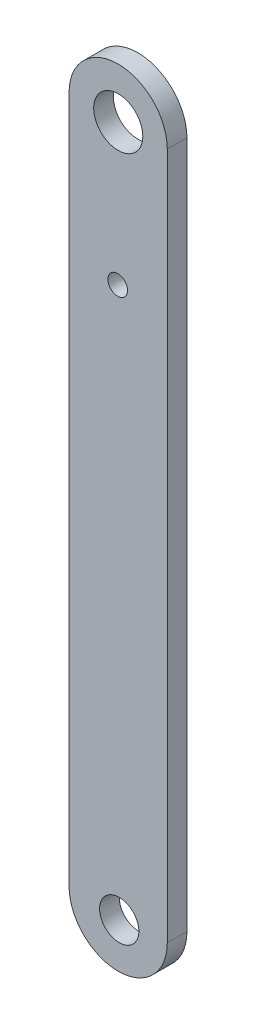
ISO-10303-21;
HEADER;
FILE_DESCRIPTION(('STEP AP214'),'2;1');
FILE_NAME('part.step','',(''),(''),'','','');
FILE_SCHEMA(('AUTOMOTIVE_DESIGN { 1 0 10303 214 1 1 1 1 }'));
ENDSEC;
DATA;
#1=APPLICATION_CONTEXT('core data for automotive mechanical design processes');
#2=APPLICATION_PROTOCOL_DEFINITION('international standard','automotive_design',2000,#1);
#3=PRODUCT_CONTEXT('',#1,'mechanical');
#4=PRODUCT('Part','Part','',(#3));
#5=PRODUCT_RELATED_PRODUCT_CATEGORY('part','',(#4));
#6=PRODUCT_DEFINITION_FORMATION('','',#4);
#7=PRODUCT_DEFINITION_CONTEXT('part definition',#1,'design');
#8=PRODUCT_DEFINITION('design','',#6,#7);
#9=PRODUCT_DEFINITION_SHAPE('','',#8);
#10=(LENGTH_UNIT() NAMED_UNIT(*) SI_UNIT(.MILLI.,.METRE.));
#11=(NAMED_UNIT(*) PLANE_ANGLE_UNIT() SI_UNIT($,.RADIAN.));
#12=(NAMED_UNIT(*) SI_UNIT($,.STERADIAN.) SOLID_ANGLE_UNIT());
#13=UNCERTAINTY_MEASURE_WITH_UNIT(LENGTH_MEASURE(1.E-05),#10,'distance_accuracy_value','');
#14=(GEOMETRIC_REPRESENTATION_CONTEXT(3) GLOBAL_UNCERTAINTY_ASSIGNED_CONTEXT((#13)) GLOBAL_UNIT_ASSIGNED_CONTEXT((#10,
#11,#12)) REPRESENTATION_CONTEXT('',''));
#15=CARTESIAN_POINT('',(0.,0.,0.));
#16=DIRECTION('',(0.,0.,1.));
#17=DIRECTION('',(1.,0.,0.));
#18=AXIS2_PLACEMENT_3D('',#15,#16,#17);
#19=CARTESIAN_POINT('',(-18.3407411522863,36.8292682926829,2.));
#20=DIRECTION('',(0.,0.,-1.));
#21=DIRECTION('',(-1.,0.,0.));
#22=AXIS2_PLACEMENT_3D('',#19,#20,#21);
#23=CYLINDRICAL_SURFACE('',#22,5.);
#24=CARTESIAN_POINT('',(-18.3407411522863,36.8292682926829,0.));
#25=DIRECTION('',(0.,0.,1.));
#26=DIRECTION('',(-1.,0.,0.));
#27=AXIS2_PLACEMENT_3D('',#24,#25,#26);
#28=CIRCLE('',#27,5.);
#29=CARTESIAN_POINT('',(-13.3407411522863,36.8292682926829,0.));
#30=VERTEX_POINT('',#29);
#31=CARTESIAN_POINT('',(-23.3407411522863,36.8292682926829,0.));
#32=VERTEX_POINT('',#31);
#33=EDGE_CURVE('E117',#30,#32,#28,.T.);
#34=ORIENTED_EDGE('',*,*,#33,.T.);
#35=DIRECTION('',(0.,0.,-1.));
#36=VECTOR('',#35,1.);
#37=CARTESIAN_POINT('',(-23.3407411522863,36.8292682926829,2.));
#38=LINE('',#37,#36);
#39=CARTESIAN_POINT('',(-23.3407411522863,36.8292682926829,2.));
#40=VERTEX_POINT('',#39);
#41=EDGE_CURVE('E11',#40,#32,#38,.T.);
#42=ORIENTED_EDGE('',*,*,#41,.F.);
#43=CARTESIAN_POINT('',(-18.3407411522863,36.8292682926829,2.));
#44=DIRECTION('',(0.,0.,1.));
#45=DIRECTION('',(-1.,0.,0.));
#46=AXIS2_PLACEMENT_3D('',#43,#44,#45);
#47=CIRCLE('',#46,5.);
#48=CARTESIAN_POINT('',(-13.3407411522863,36.8292682926829,2.));
#49=VERTEX_POINT('',#48);
#50=EDGE_CURVE('E101',#49,#40,#47,.T.);
#51=ORIENTED_EDGE('',*,*,#50,.F.);
#52=DIRECTION('',(0.,0.,-1.));
#53=VECTOR('',#52,1.);
#54=CARTESIAN_POINT('',(-13.3407411522863,36.8292682926829,2.));
#55=LINE('',#54,#53);
#56=EDGE_CURVE('E113',#49,#30,#55,.T.);
#57=ORIENTED_EDGE('',*,*,#56,.T.);
#58=EDGE_LOOP('',(#34,#42,#51,#57));
#59=FACE_BOUND('',#58,.T.);
#60=ADVANCED_FACE('F49',(#59),#23,.T.);
#61=CARTESIAN_POINT('',(-23.3407411522863,36.8292682926829,2.));
#62=DIRECTION('',(1.,0.,0.));
#63=DIRECTION('',(0.,1.,0.));
#64=AXIS2_PLACEMENT_3D('',#61,#62,#63);
#65=PLANE('',#64);
#66=DIRECTION('',(0.,-1.,0.));
#67=VECTOR('',#66,1.);
#68=CARTESIAN_POINT('',(-23.3407411522863,36.8292682926829,0.));
#69=LINE('',#68,#67);
#70=CARTESIAN_POINT('',(-23.3407411522862,-33.1707317073171,0.));
#71=VERTEX_POINT('',#70);
#72=EDGE_CURVE('E106',#32,#71,#69,.T.);
#73=ORIENTED_EDGE('',*,*,#72,.T.);
#74=DIRECTION('',(0.,0.,-1.));
#75=VECTOR('',#74,1.);
#76=CARTESIAN_POINT('',(-23.3407411522862,-33.1707317073171,2.));
#77=LINE('',#76,#75);
#78=CARTESIAN_POINT('',(-23.3407411522862,-33.1707317073171,2.));
#79=VERTEX_POINT('',#78);
#80=EDGE_CURVE('E58',#79,#71,#77,.T.);
#81=ORIENTED_EDGE('',*,*,#80,.F.);
#82=DIRECTION('',(0.,-1.,0.));
#83=VECTOR('',#82,1.);
#84=CARTESIAN_POINT('',(-23.3407411522863,36.8292682926829,2.));
#85=LINE('',#84,#83);
#86=EDGE_CURVE('E96',#40,#79,#85,.T.);
#87=ORIENTED_EDGE('',*,*,#86,.F.);
#88=ORIENTED_EDGE('',*,*,#41,.T.);
#89=EDGE_LOOP('',(#73,#81,#87,#88));
#90=FACE_BOUND('',#89,.T.);
#91=ADVANCED_FACE('F105',(#90),#65,.F.);
#92=CARTESIAN_POINT('',(-18.3407411522862,-33.1707317073171,2.));
#93=DIRECTION('',(0.,0.,-1.));
#94=DIRECTION('',(-1.,0.,0.));
#95=AXIS2_PLACEMENT_3D('',#92,#93,#94);
#96=CYLINDRICAL_SURFACE('',#95,5.);
#97=CARTESIAN_POINT('',(-18.3407411522862,-33.1707317073171,0.));
#98=DIRECTION('',(0.,0.,1.));
#99=DIRECTION('',(1.,0.,0.));
#100=AXIS2_PLACEMENT_3D('',#97,#98,#99);
#101=CIRCLE('',#100,5.);
#102=CARTESIAN_POINT('',(-13.3407411522862,-33.1707317073171,0.));
#103=VERTEX_POINT('',#102);
#104=EDGE_CURVE('E83',#71,#103,#101,.T.);
#105=ORIENTED_EDGE('',*,*,#104,.T.);
#106=DIRECTION('',(0.,0.,-1.));
#107=VECTOR('',#106,1.);
#108=CARTESIAN_POINT('',(-13.3407411522862,-33.1707317073171,2.));
#109=LINE('',#108,#107);
#110=CARTESIAN_POINT('',(-13.3407411522862,-33.1707317073171,2.));
#111=VERTEX_POINT('',#110);
#112=EDGE_CURVE('E108',#111,#103,#109,.T.);
#113=ORIENTED_EDGE('',*,*,#112,.F.);
#114=CARTESIAN_POINT('',(-18.3407411522862,-33.1707317073171,2.));
#115=DIRECTION('',(0.,0.,1.));
#116=DIRECTION('',(1.,0.,0.));
#117=AXIS2_PLACEMENT_3D('',#114,#115,#116);
#118=CIRCLE('',#117,5.);
#119=EDGE_CURVE('E99',#79,#111,#118,.T.);
#120=ORIENTED_EDGE('',*,*,#119,.F.);
#121=ORIENTED_EDGE('',*,*,#80,.T.);
#122=EDGE_LOOP('',(#105,#113,#120,#121));
#123=FACE_BOUND('',#122,.T.);
#124=ADVANCED_FACE('F109',(#123),#96,.T.);
#125=CARTESIAN_POINT('',(-13.3407411522862,-33.1707317073171,2.));
#126=DIRECTION('',(-1.,0.,0.));
#127=DIRECTION('',(0.,-1.,0.));
#128=AXIS2_PLACEMENT_3D('',#125,#126,#127);
#129=PLANE('',#128);
#130=DIRECTION('',(0.,1.,0.));
#131=VECTOR('',#130,1.);
#132=CARTESIAN_POINT('',(-13.3407411522862,-33.1707317073171,0.));
#133=LINE('',#132,#131);
#134=EDGE_CURVE('E89',#103,#30,#133,.T.);
#135=ORIENTED_EDGE('',*,*,#134,.T.);
#136=ORIENTED_EDGE('',*,*,#56,.F.);
#137=DIRECTION('',(0.,1.,0.));
#138=VECTOR('',#137,1.);
#139=CARTESIAN_POINT('',(-13.3407411522862,-33.1707317073171,2.));
#140=LINE('',#139,#138);
#141=EDGE_CURVE('E66',#111,#49,#140,.T.);
#142=ORIENTED_EDGE('',*,*,#141,.F.);
#143=ORIENTED_EDGE('',*,*,#112,.T.);
#144=EDGE_LOOP('',(#135,#136,#142,#143));
#145=FACE_BOUND('',#144,.T.);
#146=ADVANCED_FACE('F131',(#145),#129,.F.);
#147=CARTESIAN_POINT('',(-18.3407411522863,36.8292682926829,2.));
#148=DIRECTION('',(0.,0.,-1.));
#149=DIRECTION('',(-1.,0.,0.));
#150=AXIS2_PLACEMENT_3D('',#147,#148,#149);
#151=PLANE('',#150);
#152=CARTESIAN_POINT('',(-18.3359512369453,36.7097426622821,2.));
#153=DIRECTION('',(0.,0.,1.));
#154=DIRECTION('',(1.,0.,0.));
#155=AXIS2_PLACEMENT_3D('',#152,#153,#154);
#156=CIRCLE('',#155,2.5);
#157=CARTESIAN_POINT('',(-15.8359512369453,36.7097426622821,2.));
#158=VERTEX_POINT('',#157);
#159=EDGE_CURVE('E154',#158,#158,#156,.T.);
#160=ORIENTED_EDGE('',*,*,#159,.F.);
#161=EDGE_LOOP('',(#160));
#162=FACE_BOUND('',#161,.T.);
#163=CARTESIAN_POINT('',(-18.3870563319339,22.3304896398927,2.));
#164=DIRECTION('',(0.,0.,1.));
#165=DIRECTION('',(1.,0.,0.));
#166=AXIS2_PLACEMENT_3D('',#163,#164,#165);
#167=CIRCLE('',#166,1.);
#168=CARTESIAN_POINT('',(-17.3870563319338,22.3304896398927,2.));
#169=VERTEX_POINT('',#168);
#170=EDGE_CURVE('E150',#169,#169,#167,.T.);
#171=ORIENTED_EDGE('',*,*,#170,.F.);
#172=EDGE_LOOP('',(#171));
#173=FACE_BOUND('',#172,.T.);
#174=CARTESIAN_POINT('',(-18.2331567740079,-33.5914569183988,2.));
#175=DIRECTION('',(0.,0.,1.));
#176=DIRECTION('',(1.,0.,0.));
#177=AXIS2_PLACEMENT_3D('',#174,#175,#176);
#178=CIRCLE('',#177,2.);
#179=CARTESIAN_POINT('',(-16.2331567740079,-33.5914569183988,2.));
#180=VERTEX_POINT('',#179);
#181=EDGE_CURVE('E142',#180,#180,#178,.T.);
#182=ORIENTED_EDGE('',*,*,#181,.F.);
#183=EDGE_LOOP('',(#182));
#184=FACE_BOUND('',#183,.T.);
#185=ORIENTED_EDGE('',*,*,#50,.T.);
#186=ORIENTED_EDGE('',*,*,#86,.T.);
#187=ORIENTED_EDGE('',*,*,#119,.T.);
#188=ORIENTED_EDGE('',*,*,#141,.T.);
#189=EDGE_LOOP('',(#185,#186,#187,#188));
#190=FACE_BOUND('',#189,.T.);
#191=ADVANCED_FACE('F97',(#162,#173,#184,#190),#151,.F.);
#192=CARTESIAN_POINT('',(-18.3407411522863,36.8292682926829,0.));
#193=DIRECTION('',(0.,0.,-1.));
#194=DIRECTION('',(-1.,0.,0.));
#195=AXIS2_PLACEMENT_3D('',#192,#193,#194);
#196=PLANE('',#195);
#197=CARTESIAN_POINT('',(-18.3359512369453,36.7097426622821,0.));
#198=DIRECTION('',(0.,0.,1.));
#199=DIRECTION('',(1.,0.,0.));
#200=AXIS2_PLACEMENT_3D('',#197,#198,#199);
#201=CIRCLE('',#200,2.5);
#202=CARTESIAN_POINT('',(-15.8359512369453,36.7097426622821,0.));
#203=VERTEX_POINT('',#202);
#204=EDGE_CURVE('E121',#203,#203,#201,.T.);
#205=ORIENTED_EDGE('',*,*,#204,.T.);
#206=EDGE_LOOP('',(#205));
#207=FACE_BOUND('',#206,.T.);
#208=CARTESIAN_POINT('',(-18.3870563319339,22.3304896398927,0.));
#209=DIRECTION('',(0.,0.,1.));
#210=DIRECTION('',(1.,0.,0.));
#211=AXIS2_PLACEMENT_3D('',#208,#209,#210);
#212=CIRCLE('',#211,1.);
#213=CARTESIAN_POINT('',(-17.3870563319338,22.3304896398927,0.));
#214=VERTEX_POINT('',#213);
#215=EDGE_CURVE('E146',#214,#214,#212,.T.);
#216=ORIENTED_EDGE('',*,*,#215,.T.);
#217=EDGE_LOOP('',(#216));
#218=FACE_BOUND('',#217,.T.);
#219=CARTESIAN_POINT('',(-18.2331567740079,-33.5914569183988,0.));
#220=DIRECTION('',(0.,0.,1.));
#221=DIRECTION('',(1.,0.,0.));
#222=AXIS2_PLACEMENT_3D('',#219,#220,#221);
#223=CIRCLE('',#222,2.);
#224=CARTESIAN_POINT('',(-16.2331567740079,-33.5914569183988,0.));
#225=VERTEX_POINT('',#224);
#226=EDGE_CURVE('E138',#225,#225,#223,.T.);
#227=ORIENTED_EDGE('',*,*,#226,.T.);
#228=EDGE_LOOP('',(#227));
#229=FACE_BOUND('',#228,.T.);
#230=ORIENTED_EDGE('',*,*,#33,.F.);
#231=ORIENTED_EDGE('',*,*,#134,.F.);
#232=ORIENTED_EDGE('',*,*,#104,.F.);
#233=ORIENTED_EDGE('',*,*,#72,.F.);
#234=EDGE_LOOP('',(#230,#231,#232,#233));
#235=FACE_BOUND('',#234,.T.);
#236=ADVANCED_FACE('F134',(#207,#218,#229,#235),#196,.T.);
#237=CARTESIAN_POINT('',(-18.2331567740079,-33.5914569183988,0.));
#238=DIRECTION('',(0.,0.,1.));
#239=DIRECTION('',(1.,0.,0.));
#240=AXIS2_PLACEMENT_3D('',#237,#238,#239);
#241=CYLINDRICAL_SURFACE('',#240,2.);
#242=ORIENTED_EDGE('',*,*,#226,.F.);
#243=EDGE_LOOP('',(#242));
#244=FACE_BOUND('',#243,.T.);
#245=ORIENTED_EDGE('',*,*,#181,.T.);
#246=EDGE_LOOP('',(#245));
#247=FACE_BOUND('',#246,.T.);
#248=ADVANCED_FACE('F178',(#244,#247),#241,.F.);
#249=CARTESIAN_POINT('',(-18.3870563319339,22.3304896398927,0.));
#250=DIRECTION('',(0.,0.,1.));
#251=DIRECTION('',(1.,0.,0.));
#252=AXIS2_PLACEMENT_3D('',#249,#250,#251);
#253=CYLINDRICAL_SURFACE('',#252,1.);
#254=ORIENTED_EDGE('',*,*,#215,.F.);
#255=EDGE_LOOP('',(#254));
#256=FACE_BOUND('',#255,.T.);
#257=ORIENTED_EDGE('',*,*,#170,.T.);
#258=EDGE_LOOP('',(#257));
#259=FACE_BOUND('',#258,.T.);
#260=ADVANCED_FACE('F167',(#256,#259),#253,.F.);
#261=CARTESIAN_POINT('',(-18.3359512369453,36.7097426622821,0.));
#262=DIRECTION('',(0.,0.,1.));
#263=DIRECTION('',(1.,0.,0.));
#264=AXIS2_PLACEMENT_3D('',#261,#262,#263);
#265=CYLINDRICAL_SURFACE('',#264,2.5);
#266=ORIENTED_EDGE('',*,*,#204,.F.);
#267=EDGE_LOOP('',(#266));
#268=FACE_BOUND('',#267,.T.);
#269=ORIENTED_EDGE('',*,*,#159,.T.);
#270=EDGE_LOOP('',(#269));
#271=FACE_BOUND('',#270,.T.);
#272=ADVANCED_FACE('F164',(#268,#271),#265,.F.);
#273=CLOSED_SHELL('',(#60,#91,#124,#146,#191,#236,#248,#260,#272));
#274=MANIFOLD_SOLID_BREP('B2',#273);
#275=ADVANCED_BREP_SHAPE_REPRESENTATION('',(#18,#274),#14);
#276=SHAPE_DEFINITION_REPRESENTATION(#9,#275);
ENDSEC;
END-ISO-10303-21;
